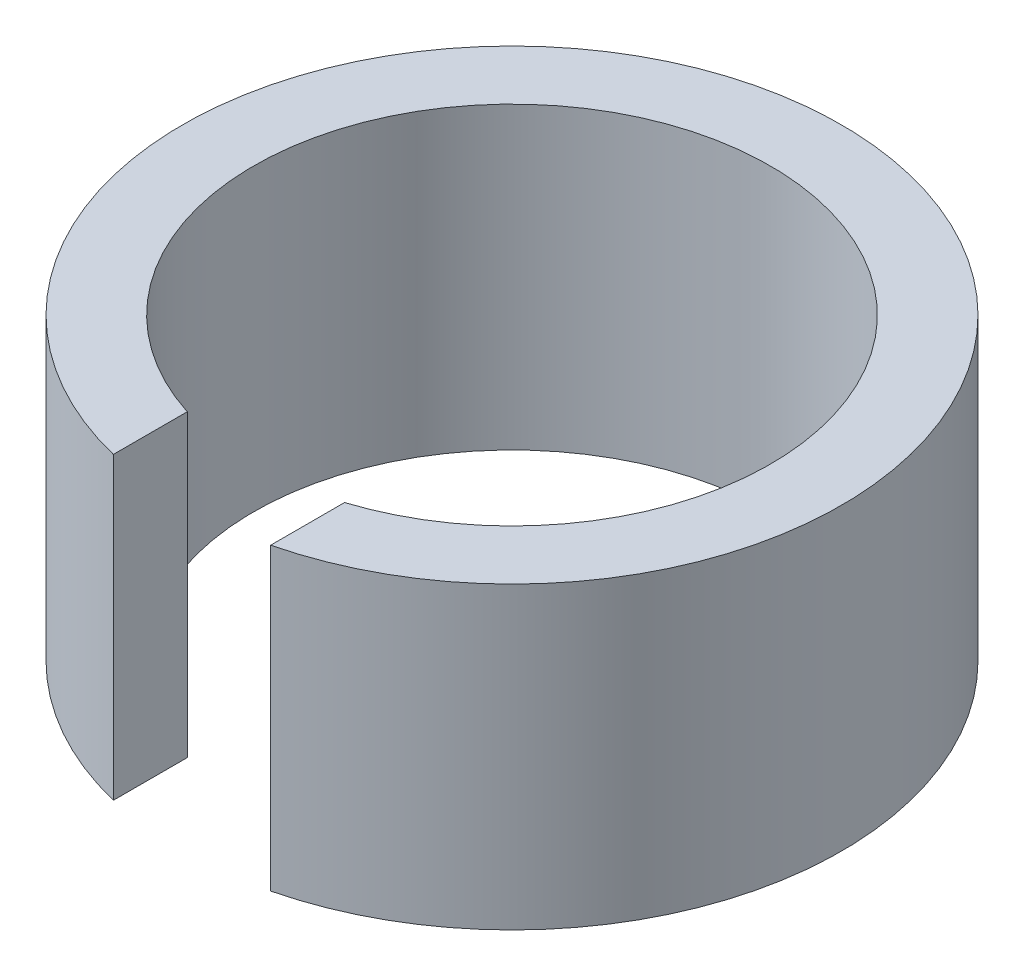
ISO-10303-21;
HEADER;
FILE_DESCRIPTION(('STEP AP214'),'2;1');
FILE_NAME('part.step','',(''),(''),'','','');
FILE_SCHEMA(('AUTOMOTIVE_DESIGN { 1 0 10303 214 1 1 1 1 }'));
ENDSEC;
DATA;
#1=APPLICATION_CONTEXT('core data for automotive mechanical design processes');
#2=APPLICATION_PROTOCOL_DEFINITION('international standard','automotive_design',2000,#1);
#3=PRODUCT_CONTEXT('',#1,'mechanical');
#4=PRODUCT('Part','Part','',(#3));
#5=PRODUCT_RELATED_PRODUCT_CATEGORY('part','',(#4));
#6=PRODUCT_DEFINITION_FORMATION('','',#4);
#7=PRODUCT_DEFINITION_CONTEXT('part definition',#1,'design');
#8=PRODUCT_DEFINITION('design','',#6,#7);
#9=PRODUCT_DEFINITION_SHAPE('','',#8);
#10=(LENGTH_UNIT() NAMED_UNIT(*) SI_UNIT(.MILLI.,.METRE.));
#11=(NAMED_UNIT(*) PLANE_ANGLE_UNIT() SI_UNIT($,.RADIAN.));
#12=(NAMED_UNIT(*) SI_UNIT($,.STERADIAN.) SOLID_ANGLE_UNIT());
#13=UNCERTAINTY_MEASURE_WITH_UNIT(LENGTH_MEASURE(1.E-05),#10,'distance_accuracy_value','');
#14=(GEOMETRIC_REPRESENTATION_CONTEXT(3) GLOBAL_UNCERTAINTY_ASSIGNED_CONTEXT((#13)) GLOBAL_UNIT_ASSIGNED_CONTEXT((#10,
#11,#12)) REPRESENTATION_CONTEXT('',''));
#15=CARTESIAN_POINT('',(0.,0.,0.));
#16=DIRECTION('',(0.,0.,1.));
#17=DIRECTION('',(1.,0.,0.));
#18=AXIS2_PLACEMENT_3D('',#15,#16,#17);
#19=CARTESIAN_POINT('',(1.05,4.,0.));
#20=DIRECTION('',(1.,0.,0.));
#21=DIRECTION('',(0.,0.,-1.));
#22=AXIS2_PLACEMENT_3D('',#19,#20,#21);
#23=PLANE('',#22);
#24=DIRECTION('',(0.,0.,1.));
#25=VECTOR('',#24,1.);
#26=CARTESIAN_POINT('',(1.05,0.,0.));
#27=LINE('',#26,#25);
#28=CARTESIAN_POINT('',(1.05,0.,3.286335345031));
#29=VERTEX_POINT('',#28);
#30=CARTESIAN_POINT('',(1.05,0.,4.27287959109545));
#31=VERTEX_POINT('',#30);
#32=EDGE_CURVE('E98',#29,#31,#27,.T.);
#33=ORIENTED_EDGE('',*,*,#32,.T.);
#34=DIRECTION('',(0.,-1.,0.));
#35=VECTOR('',#34,1.);
#36=CARTESIAN_POINT('',(1.05,4.,4.27287959109545));
#37=LINE('',#36,#35);
#38=CARTESIAN_POINT('',(1.05,4.,4.27287959109545));
#39=VERTEX_POINT('',#38);
#40=EDGE_CURVE('E11',#39,#31,#37,.T.);
#41=ORIENTED_EDGE('',*,*,#40,.F.);
#42=DIRECTION('',(0.,0.,1.));
#43=VECTOR('',#42,1.);
#44=CARTESIAN_POINT('',(1.05,4.,0.));
#45=LINE('',#44,#43);
#46=CARTESIAN_POINT('',(1.05,4.,3.286335345031));
#47=VERTEX_POINT('',#46);
#48=EDGE_CURVE('E84',#47,#39,#45,.T.);
#49=ORIENTED_EDGE('',*,*,#48,.F.);
#50=DIRECTION('',(0.,-1.,0.));
#51=VECTOR('',#50,1.);
#52=CARTESIAN_POINT('',(1.05,4.,3.286335345031));
#53=LINE('',#52,#51);
#54=EDGE_CURVE('E51',#47,#29,#53,.T.);
#55=ORIENTED_EDGE('',*,*,#54,.T.);
#56=EDGE_LOOP('',(#33,#41,#49,#55));
#57=FACE_BOUND('',#56,.T.);
#58=ADVANCED_FACE('F35',(#57),#23,.F.);
#59=CARTESIAN_POINT('',(0.,4.,0.));
#60=DIRECTION('',(0.,-1.,0.));
#61=DIRECTION('',(0.,0.,-1.));
#62=AXIS2_PLACEMENT_3D('',#59,#60,#61);
#63=CYLINDRICAL_SURFACE('',#62,4.4);
#64=CARTESIAN_POINT('',(0.,0.,0.));
#65=DIRECTION('',(0.,1.,0.));
#66=DIRECTION('',(0.,0.,1.));
#67=AXIS2_PLACEMENT_3D('',#64,#65,#66);
#68=CIRCLE('',#67,4.4);
#69=CARTESIAN_POINT('',(-1.05,0.,4.27287959109545));
#70=VERTEX_POINT('',#69);
#71=EDGE_CURVE('E89',#31,#70,#68,.T.);
#72=ORIENTED_EDGE('',*,*,#71,.T.);
#73=DIRECTION('',(0.,-1.,0.));
#74=VECTOR('',#73,1.);
#75=CARTESIAN_POINT('',(-1.05,4.,4.27287959109545));
#76=LINE('',#75,#74);
#77=CARTESIAN_POINT('',(-1.05,4.,4.27287959109545));
#78=VERTEX_POINT('',#77);
#79=EDGE_CURVE('E43',#78,#70,#76,.T.);
#80=ORIENTED_EDGE('',*,*,#79,.F.);
#81=CARTESIAN_POINT('',(0.,4.,0.));
#82=DIRECTION('',(0.,1.,0.));
#83=DIRECTION('',(0.,0.,1.));
#84=AXIS2_PLACEMENT_3D('',#81,#82,#83);
#85=CIRCLE('',#84,4.4);
#86=EDGE_CURVE('E76',#39,#78,#85,.T.);
#87=ORIENTED_EDGE('',*,*,#86,.F.);
#88=ORIENTED_EDGE('',*,*,#40,.T.);
#89=EDGE_LOOP('',(#72,#80,#87,#88));
#90=FACE_BOUND('',#89,.T.);
#91=ADVANCED_FACE('F88',(#90),#63,.T.);
#92=CARTESIAN_POINT('',(-1.05,4.,0.));
#93=DIRECTION('',(1.,0.,0.));
#94=DIRECTION('',(0.,0.,-1.));
#95=AXIS2_PLACEMENT_3D('',#92,#93,#94);
#96=PLANE('',#95);
#97=DIRECTION('',(0.,0.,1.));
#98=VECTOR('',#97,1.);
#99=CARTESIAN_POINT('',(-1.05,0.,0.));
#100=LINE('',#99,#98);
#101=CARTESIAN_POINT('',(-1.05,0.,3.286335345031));
#102=VERTEX_POINT('',#101);
#103=EDGE_CURVE('E101',#102,#70,#100,.T.);
#104=ORIENTED_EDGE('',*,*,#103,.F.);
#105=DIRECTION('',(0.,-1.,0.));
#106=VECTOR('',#105,1.);
#107=CARTESIAN_POINT('',(-1.05,4.,3.286335345031));
#108=LINE('',#107,#106);
#109=CARTESIAN_POINT('',(-1.05,4.,3.286335345031));
#110=VERTEX_POINT('',#109);
#111=EDGE_CURVE('E65',#110,#102,#108,.T.);
#112=ORIENTED_EDGE('',*,*,#111,.F.);
#113=DIRECTION('',(0.,0.,1.));
#114=VECTOR('',#113,1.);
#115=CARTESIAN_POINT('',(-1.05,4.,0.));
#116=LINE('',#115,#114);
#117=EDGE_CURVE('E83',#110,#78,#116,.T.);
#118=ORIENTED_EDGE('',*,*,#117,.T.);
#119=ORIENTED_EDGE('',*,*,#79,.T.);
#120=EDGE_LOOP('',(#104,#112,#118,#119));
#121=FACE_BOUND('',#120,.T.);
#122=ADVANCED_FACE('F92',(#121),#96,.T.);
#123=CARTESIAN_POINT('',(0.,4.,0.));
#124=DIRECTION('',(0.,-1.,0.));
#125=DIRECTION('',(0.,0.,-1.));
#126=AXIS2_PLACEMENT_3D('',#123,#124,#125);
#127=CYLINDRICAL_SURFACE('',#126,3.45);
#128=CARTESIAN_POINT('',(0.,0.,0.));
#129=DIRECTION('',(0.,1.,0.));
#130=DIRECTION('',(0.,0.,1.));
#131=AXIS2_PLACEMENT_3D('',#128,#129,#130);
#132=CIRCLE('',#131,3.45);
#133=EDGE_CURVE('E103',#29,#102,#132,.T.);
#134=ORIENTED_EDGE('',*,*,#133,.F.);
#135=ORIENTED_EDGE('',*,*,#54,.F.);
#136=CARTESIAN_POINT('',(0.,4.,0.));
#137=DIRECTION('',(0.,1.,0.));
#138=DIRECTION('',(0.,0.,1.));
#139=AXIS2_PLACEMENT_3D('',#136,#137,#138);
#140=CIRCLE('',#139,3.45);
#141=EDGE_CURVE('E93',#47,#110,#140,.T.);
#142=ORIENTED_EDGE('',*,*,#141,.T.);
#143=ORIENTED_EDGE('',*,*,#111,.T.);
#144=EDGE_LOOP('',(#134,#135,#142,#143));
#145=FACE_BOUND('',#144,.T.);
#146=ADVANCED_FACE('F109',(#145),#127,.F.);
#147=CARTESIAN_POINT('',(0.,4.,0.));
#148=DIRECTION('',(0.,1.,0.));
#149=DIRECTION('',(0.,0.,1.));
#150=AXIS2_PLACEMENT_3D('',#147,#148,#149);
#151=PLANE('',#150);
#152=ORIENTED_EDGE('',*,*,#48,.T.);
#153=ORIENTED_EDGE('',*,*,#86,.T.);
#154=ORIENTED_EDGE('',*,*,#117,.F.);
#155=ORIENTED_EDGE('',*,*,#141,.F.);
#156=EDGE_LOOP('',(#152,#153,#154,#155));
#157=FACE_BOUND('',#156,.T.);
#158=ADVANCED_FACE('F80',(#157),#151,.T.);
#159=CARTESIAN_POINT('',(0.,0.,0.));
#160=DIRECTION('',(0.,1.,0.));
#161=DIRECTION('',(0.,0.,1.));
#162=AXIS2_PLACEMENT_3D('',#159,#160,#161);
#163=PLANE('',#162);
#164=ORIENTED_EDGE('',*,*,#32,.F.);
#165=ORIENTED_EDGE('',*,*,#133,.T.);
#166=ORIENTED_EDGE('',*,*,#103,.T.);
#167=ORIENTED_EDGE('',*,*,#71,.F.);
#168=EDGE_LOOP('',(#164,#165,#166,#167));
#169=FACE_BOUND('',#168,.T.);
#170=ADVANCED_FACE('F108',(#169),#163,.F.);
#171=CLOSED_SHELL('',(#58,#91,#122,#146,#158,#170));
#172=MANIFOLD_SOLID_BREP('B2',#171);
#173=ADVANCED_BREP_SHAPE_REPRESENTATION('',(#18,#172),#14);
#174=SHAPE_DEFINITION_REPRESENTATION(#9,#173);
ENDSEC;
END-ISO-10303-21;
